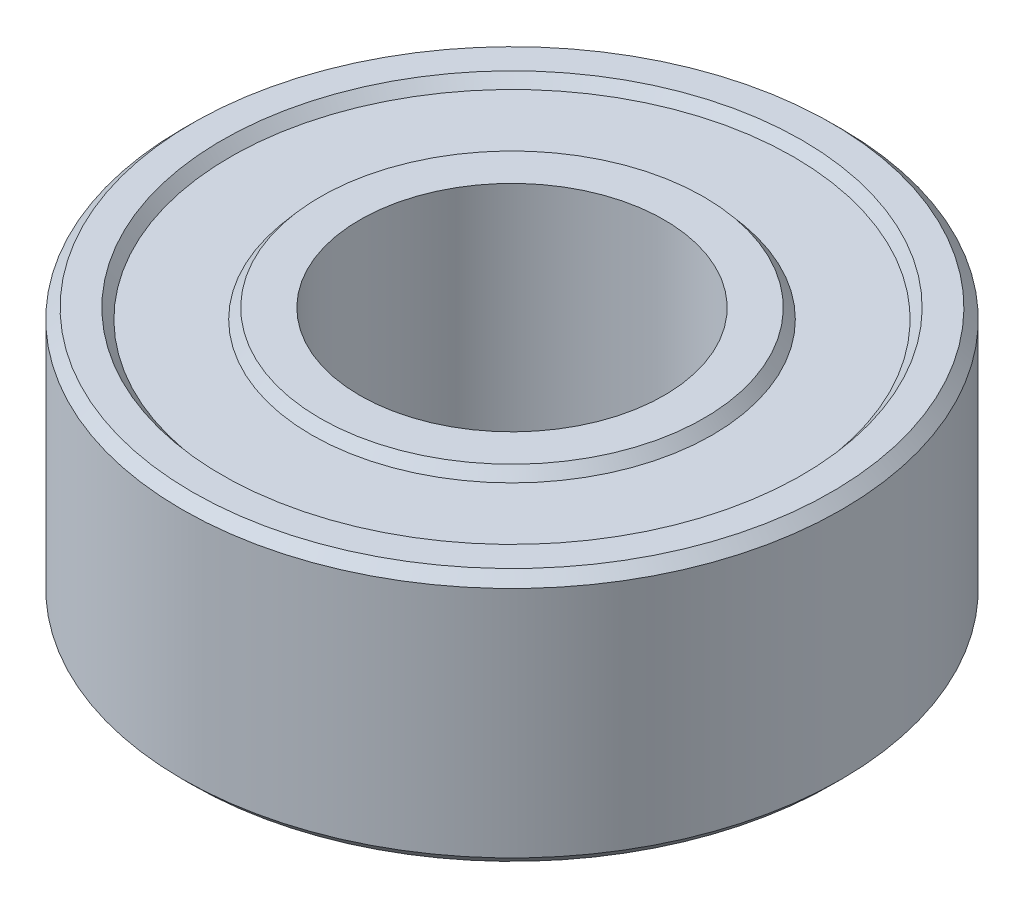
ISO-10303-21;
HEADER;
FILE_DESCRIPTION(('STEP AP214'),'2;1');
FILE_NAME('part.step','',(''),(''),'','','');
FILE_SCHEMA(('AUTOMOTIVE_DESIGN { 1 0 10303 214 1 1 1 1 }'));
ENDSEC;
DATA;
#1=APPLICATION_CONTEXT('core data for automotive mechanical design processes');
#2=APPLICATION_PROTOCOL_DEFINITION('international standard','automotive_design',2000,#1);
#3=PRODUCT_CONTEXT('',#1,'mechanical');
#4=PRODUCT('Part','Part','',(#3));
#5=PRODUCT_RELATED_PRODUCT_CATEGORY('part','',(#4));
#6=PRODUCT_DEFINITION_FORMATION('','',#4);
#7=PRODUCT_DEFINITION_CONTEXT('part definition',#1,'design');
#8=PRODUCT_DEFINITION('design','',#6,#7);
#9=PRODUCT_DEFINITION_SHAPE('','',#8);
#10=(LENGTH_UNIT() NAMED_UNIT(*) SI_UNIT(.MILLI.,.METRE.));
#11=(NAMED_UNIT(*) PLANE_ANGLE_UNIT() SI_UNIT($,.RADIAN.));
#12=(NAMED_UNIT(*) SI_UNIT($,.STERADIAN.) SOLID_ANGLE_UNIT());
#13=UNCERTAINTY_MEASURE_WITH_UNIT(LENGTH_MEASURE(1.E-05),#10,'distance_accuracy_value','');
#14=(GEOMETRIC_REPRESENTATION_CONTEXT(3) GLOBAL_UNCERTAINTY_ASSIGNED_CONTEXT((#13)) GLOBAL_UNIT_ASSIGNED_CONTEXT((#10,
#11,#12)) REPRESENTATION_CONTEXT('',''));
#15=CARTESIAN_POINT('',(0.,0.,0.));
#16=DIRECTION('',(0.,0.,1.));
#17=DIRECTION('',(1.,0.,0.));
#18=AXIS2_PLACEMENT_3D('',#15,#16,#17);
#19=CARTESIAN_POINT('',(0.,5.,0.));
#20=DIRECTION('',(0.,1.,0.));
#21=DIRECTION('',(0.,0.,1.));
#22=AXIS2_PLACEMENT_3D('',#19,#20,#21);
#23=PLANE('',#22);
#24=CARTESIAN_POINT('',(0.,5.,0.));
#25=DIRECTION('',(0.,1.,0.));
#26=DIRECTION('',(0.,0.,1.));
#27=AXIS2_PLACEMENT_3D('',#24,#25,#26);
#28=CIRCLE('',#27,3.);
#29=CARTESIAN_POINT('',(0.,5.,3.));
#30=VERTEX_POINT('',#29);
#31=EDGE_CURVE('E64',#30,#30,#28,.T.);
#32=ORIENTED_EDGE('',*,*,#31,.F.);
#33=EDGE_LOOP('',(#32));
#34=FACE_BOUND('',#33,.T.);
#35=CARTESIAN_POINT('',(0.,5.,0.));
#36=DIRECTION('',(0.,-1.,0.));
#37=DIRECTION('',(0.,0.,-1.));
#38=AXIS2_PLACEMENT_3D('',#35,#36,#37);
#39=CIRCLE('',#38,3.78218007376455);
#40=CARTESIAN_POINT('',(0.,5.,-3.78218007376455));
#41=VERTEX_POINT('',#40);
#42=EDGE_CURVE('E77',#41,#41,#39,.T.);
#43=ORIENTED_EDGE('',*,*,#42,.F.);
#44=EDGE_LOOP('',(#43));
#45=FACE_BOUND('',#44,.T.);
#46=ADVANCED_FACE('F39',(#34,#45),#23,.T.);
#47=CARTESIAN_POINT('',(0.,0.,0.));
#48=DIRECTION('',(0.,1.,0.));
#49=DIRECTION('',(0.,0.,1.));
#50=AXIS2_PLACEMENT_3D('',#47,#48,#49);
#51=PLANE('',#50);
#52=CARTESIAN_POINT('',(0.,0.,0.));
#53=DIRECTION('',(0.,-1.,0.));
#54=DIRECTION('',(0.,0.,-1.));
#55=AXIS2_PLACEMENT_3D('',#52,#53,#54);
#56=CIRCLE('',#55,3.78218007376455);
#57=CARTESIAN_POINT('',(0.,0.,-3.78218007376455));
#58=VERTEX_POINT('',#57);
#59=EDGE_CURVE('E78',#58,#58,#56,.T.);
#60=ORIENTED_EDGE('',*,*,#59,.T.);
#61=EDGE_LOOP('',(#60));
#62=FACE_BOUND('',#61,.T.);
#63=CARTESIAN_POINT('',(0.,0.,0.));
#64=DIRECTION('',(0.,1.,0.));
#65=DIRECTION('',(0.,0.,1.));
#66=AXIS2_PLACEMENT_3D('',#63,#64,#65);
#67=CIRCLE('',#66,3.);
#68=CARTESIAN_POINT('',(0.,0.,3.));
#69=VERTEX_POINT('',#68);
#70=EDGE_CURVE('E65',#69,#69,#67,.T.);
#71=ORIENTED_EDGE('',*,*,#70,.T.);
#72=EDGE_LOOP('',(#71));
#73=FACE_BOUND('',#72,.T.);
#74=ADVANCED_FACE('F109',(#62,#73),#51,.F.);
#75=CARTESIAN_POINT('',(0.,5.,0.));
#76=DIRECTION('',(0.,-1.,0.));
#77=DIRECTION('',(0.,0.,-1.));
#78=AXIS2_PLACEMENT_3D('',#75,#76,#77);
#79=CYLINDRICAL_SURFACE('',#78,3.);
#80=ORIENTED_EDGE('',*,*,#31,.T.);
#81=EDGE_LOOP('',(#80));
#82=FACE_BOUND('',#81,.T.);
#83=ORIENTED_EDGE('',*,*,#70,.F.);
#84=EDGE_LOOP('',(#83));
#85=FACE_BOUND('',#84,.T.);
#86=ADVANCED_FACE('F116',(#82,#85),#79,.F.);
#87=CARTESIAN_POINT('',(0.,0.200000000000002,5.55));
#88=DIRECTION('',(0.,-1.,0.));
#89=DIRECTION('',(0.,0.,-1.));
#90=AXIS2_PLACEMENT_3D('',#87,#88,#89);
#91=PLANE('',#90);
#92=CARTESIAN_POINT('',(0.,0.2,0.));
#93=DIRECTION('',(0.,-1.,0.));
#94=DIRECTION('',(0.,0.,-1.));
#95=AXIS2_PLACEMENT_3D('',#92,#93,#94);
#96=CIRCLE('',#95,5.55);
#97=CARTESIAN_POINT('',(0.,0.199999999999999,-5.55));
#98=VERTEX_POINT('',#97);
#99=EDGE_CURVE('E86',#98,#98,#96,.T.);
#100=ORIENTED_EDGE('',*,*,#99,.T.);
#101=EDGE_LOOP('',(#100));
#102=FACE_BOUND('',#101,.T.);
#103=CARTESIAN_POINT('',(0.,0.200000000000001,0.));
#104=DIRECTION('',(0.,-1.,0.));
#105=DIRECTION('',(0.,0.,-1.));
#106=AXIS2_PLACEMENT_3D('',#103,#104,#105);
#107=CIRCLE('',#106,3.95);
#108=CARTESIAN_POINT('',(0.,0.2,-3.95));
#109=VERTEX_POINT('',#108);
#110=EDGE_CURVE('E73',#109,#109,#107,.T.);
#111=ORIENTED_EDGE('',*,*,#110,.F.);
#112=EDGE_LOOP('',(#111));
#113=FACE_BOUND('',#112,.T.);
#114=ADVANCED_FACE('F152',(#102,#113),#91,.T.);
#115=CARTESIAN_POINT('',(0.,0.,0.));
#116=DIRECTION('',(0.,1.,0.));
#117=DIRECTION('',(0.,0.,1.));
#118=AXIS2_PLACEMENT_3D('',#115,#116,#117);
#119=CONICAL_SURFACE('',#118,3.78218007376455,0.698131700797729);
#120=ORIENTED_EDGE('',*,*,#110,.T.);
#121=EDGE_LOOP('',(#120));
#122=FACE_BOUND('',#121,.T.);
#123=ORIENTED_EDGE('',*,*,#59,.F.);
#124=EDGE_LOOP('',(#123));
#125=FACE_BOUND('',#124,.T.);
#126=ADVANCED_FACE('F146',(#122,#125),#119,.T.);
#127=CARTESIAN_POINT('',(0.,0.2,0.));
#128=DIRECTION('',(0.,-1.,0.));
#129=DIRECTION('',(0.,0.,-1.));
#130=AXIS2_PLACEMENT_3D('',#127,#128,#129);
#131=CONICAL_SURFACE('',#130,5.55,0.69813170079773);
#132=CARTESIAN_POINT('',(0.,0.,0.));
#133=DIRECTION('',(0.,-1.,0.));
#134=DIRECTION('',(0.,0.,-1.));
#135=AXIS2_PLACEMENT_3D('',#132,#133,#134);
#136=CIRCLE('',#135,5.71781992623545);
#137=CARTESIAN_POINT('',(0.,0.,-5.71781992623545));
#138=VERTEX_POINT('',#137);
#139=EDGE_CURVE('E82',#138,#138,#136,.T.);
#140=ORIENTED_EDGE('',*,*,#139,.T.);
#141=EDGE_LOOP('',(#140));
#142=FACE_BOUND('',#141,.T.);
#143=ORIENTED_EDGE('',*,*,#99,.F.);
#144=EDGE_LOOP('',(#143));
#145=FACE_BOUND('',#144,.T.);
#146=ADVANCED_FACE('F137',(#142,#145),#131,.F.);
#147=CARTESIAN_POINT('',(0.,5.,0.));
#148=DIRECTION('',(0.,1.,0.));
#149=DIRECTION('',(0.,0.,1.));
#150=AXIS2_PLACEMENT_3D('',#147,#148,#149);
#151=CONICAL_SURFACE('',#150,5.71781992623546,0.69813170079773);
#152=CARTESIAN_POINT('',(0.,4.8,0.));
#153=DIRECTION('',(0.,-1.,0.));
#154=DIRECTION('',(0.,0.,-1.));
#155=AXIS2_PLACEMENT_3D('',#152,#153,#154);
#156=CIRCLE('',#155,5.55);
#157=CARTESIAN_POINT('',(0.,4.8,-5.55));
#158=VERTEX_POINT('',#157);
#159=EDGE_CURVE('E93',#158,#158,#156,.T.);
#160=ORIENTED_EDGE('',*,*,#159,.T.);
#161=EDGE_LOOP('',(#160));
#162=FACE_BOUND('',#161,.T.);
#163=CARTESIAN_POINT('',(0.,5.,0.));
#164=DIRECTION('',(0.,-1.,0.));
#165=DIRECTION('',(0.,0.,-1.));
#166=AXIS2_PLACEMENT_3D('',#163,#164,#165);
#167=CIRCLE('',#166,5.71781992623546);
#168=CARTESIAN_POINT('',(0.,5.,-5.71781992623546));
#169=VERTEX_POINT('',#168);
#170=EDGE_CURVE('E69',#169,#169,#167,.T.);
#171=ORIENTED_EDGE('',*,*,#170,.F.);
#172=EDGE_LOOP('',(#171));
#173=FACE_BOUND('',#172,.T.);
#174=ADVANCED_FACE('F135',(#162,#173),#151,.F.);
#175=CARTESIAN_POINT('',(0.,4.8,5.55));
#176=DIRECTION('',(0.,1.,0.));
#177=DIRECTION('',(0.,0.,1.));
#178=AXIS2_PLACEMENT_3D('',#175,#176,#177);
#179=PLANE('',#178);
#180=CARTESIAN_POINT('',(0.,4.8,0.));
#181=DIRECTION('',(0.,-1.,0.));
#182=DIRECTION('',(0.,0.,-1.));
#183=AXIS2_PLACEMENT_3D('',#180,#181,#182);
#184=CIRCLE('',#183,3.95);
#185=CARTESIAN_POINT('',(0.,4.8,-3.95));
#186=VERTEX_POINT('',#185);
#187=EDGE_CURVE('E97',#186,#186,#184,.T.);
#188=ORIENTED_EDGE('',*,*,#187,.T.);
#189=EDGE_LOOP('',(#188));
#190=FACE_BOUND('',#189,.T.);
#191=ORIENTED_EDGE('',*,*,#159,.F.);
#192=EDGE_LOOP('',(#191));
#193=FACE_BOUND('',#192,.T.);
#194=ADVANCED_FACE('F130',(#190,#193),#179,.T.);
#195=CARTESIAN_POINT('',(0.,4.8,0.));
#196=DIRECTION('',(0.,-1.,0.));
#197=DIRECTION('',(0.,0.,-1.));
#198=AXIS2_PLACEMENT_3D('',#195,#196,#197);
#199=CONICAL_SURFACE('',#198,3.95,0.698131700797729);
#200=ORIENTED_EDGE('',*,*,#42,.T.);
#201=EDGE_LOOP('',(#200));
#202=FACE_BOUND('',#201,.T.);
#203=ORIENTED_EDGE('',*,*,#187,.F.);
#204=EDGE_LOOP('',(#203));
#205=FACE_BOUND('',#204,.T.);
#206=ADVANCED_FACE('F105',(#202,#205),#199,.T.);
#207=CARTESIAN_POINT('',(0.,5.,0.));
#208=DIRECTION('',(0.,1.,0.));
#209=DIRECTION('',(0.,0.,1.));
#210=AXIS2_PLACEMENT_3D('',#207,#208,#209);
#211=CIRCLE('',#210,6.3);
#212=CARTESIAN_POINT('',(0.,5.,6.3));
#213=VERTEX_POINT('',#212);
#214=EDGE_CURVE('E10',#213,#213,#211,.T.);
#215=ORIENTED_EDGE('',*,*,#214,.T.);
#216=EDGE_LOOP('',(#215));
#217=FACE_BOUND('',#216,.T.);
#218=ORIENTED_EDGE('',*,*,#170,.T.);
#219=EDGE_LOOP('',(#218));
#220=FACE_BOUND('',#219,.T.);
#221=ADVANCED_FACE('F112',(#217,#220),#23,.T.);
#222=CARTESIAN_POINT('',(0.,5.,0.));
#223=DIRECTION('',(0.,-1.,0.));
#224=DIRECTION('',(0.,0.,-1.));
#225=AXIS2_PLACEMENT_3D('',#222,#223,#224);
#226=CYLINDRICAL_SURFACE('',#225,6.5);
#227=CARTESIAN_POINT('',(0.,0.199999999999996,0.));
#228=DIRECTION('',(0.,1.,0.));
#229=DIRECTION('',(0.,0.,1.));
#230=AXIS2_PLACEMENT_3D('',#227,#228,#229);
#231=CIRCLE('',#230,6.5);
#232=CARTESIAN_POINT('',(0.,0.199999999999996,6.5));
#233=VERTEX_POINT('',#232);
#234=EDGE_CURVE('E53',#233,#233,#231,.T.);
#235=ORIENTED_EDGE('',*,*,#234,.T.);
#236=EDGE_LOOP('',(#235));
#237=FACE_BOUND('',#236,.T.);
#238=CARTESIAN_POINT('',(0.,4.8,0.));
#239=DIRECTION('',(0.,1.,0.));
#240=DIRECTION('',(0.,0.,1.));
#241=AXIS2_PLACEMENT_3D('',#238,#239,#240);
#242=CIRCLE('',#241,6.5);
#243=CARTESIAN_POINT('',(0.,4.8,6.5));
#244=VERTEX_POINT('',#243);
#245=EDGE_CURVE('E58',#244,#244,#242,.F.);
#246=ORIENTED_EDGE('',*,*,#245,.T.);
#247=EDGE_LOOP('',(#246));
#248=FACE_BOUND('',#247,.T.);
#249=ADVANCED_FACE('F123',(#237,#248),#226,.T.);
#250=CARTESIAN_POINT('',(0.,0.,0.));
#251=DIRECTION('',(0.,1.,0.));
#252=DIRECTION('',(0.,0.,1.));
#253=AXIS2_PLACEMENT_3D('',#250,#251,#252);
#254=CIRCLE('',#253,6.3);
#255=CARTESIAN_POINT('',(0.,0.,6.3));
#256=VERTEX_POINT('',#255);
#257=EDGE_CURVE('E48',#256,#256,#254,.F.);
#258=ORIENTED_EDGE('',*,*,#257,.T.);
#259=EDGE_LOOP('',(#258));
#260=FACE_BOUND('',#259,.T.);
#261=ORIENTED_EDGE('',*,*,#139,.F.);
#262=EDGE_LOOP('',(#261));
#263=FACE_BOUND('',#262,.T.);
#264=ADVANCED_FACE('F119',(#260,#263),#51,.F.);
#265=CARTESIAN_POINT('',(0.,0.199999999999996,0.));
#266=DIRECTION('',(0.,1.,0.));
#267=DIRECTION('',(0.,0.,1.));
#268=AXIS2_PLACEMENT_3D('',#265,#266,#267);
#269=CONICAL_SURFACE('',#268,6.5,0.78539816339745);
#270=ORIENTED_EDGE('',*,*,#257,.F.);
#271=EDGE_LOOP('',(#270));
#272=FACE_BOUND('',#271,.T.);
#273=ORIENTED_EDGE('',*,*,#234,.F.);
#274=EDGE_LOOP('',(#273));
#275=FACE_BOUND('',#274,.T.);
#276=ADVANCED_FACE('F214',(#272,#275),#269,.T.);
#277=CARTESIAN_POINT('',(0.,5.,0.));
#278=DIRECTION('',(0.,-1.,0.));
#279=DIRECTION('',(0.,0.,-1.));
#280=AXIS2_PLACEMENT_3D('',#277,#278,#279);
#281=CONICAL_SURFACE('',#280,6.3,0.785398163397448);
#282=ORIENTED_EDGE('',*,*,#245,.F.);
#283=EDGE_LOOP('',(#282));
#284=FACE_BOUND('',#283,.T.);
#285=ORIENTED_EDGE('',*,*,#214,.F.);
#286=EDGE_LOOP('',(#285));
#287=FACE_BOUND('',#286,.T.);
#288=ADVANCED_FACE('F42',(#284,#287),#281,.T.);
#289=CLOSED_SHELL('',(#46,#74,#86,#114,#126,#146,#174,#194,#206,#221,#249,#264,#276,#288));
#290=MANIFOLD_SOLID_BREP('B2',#289);
#291=ADVANCED_BREP_SHAPE_REPRESENTATION('',(#18,#290),#14);
#292=SHAPE_DEFINITION_REPRESENTATION(#9,#291);
ENDSEC;
END-ISO-10303-21;
